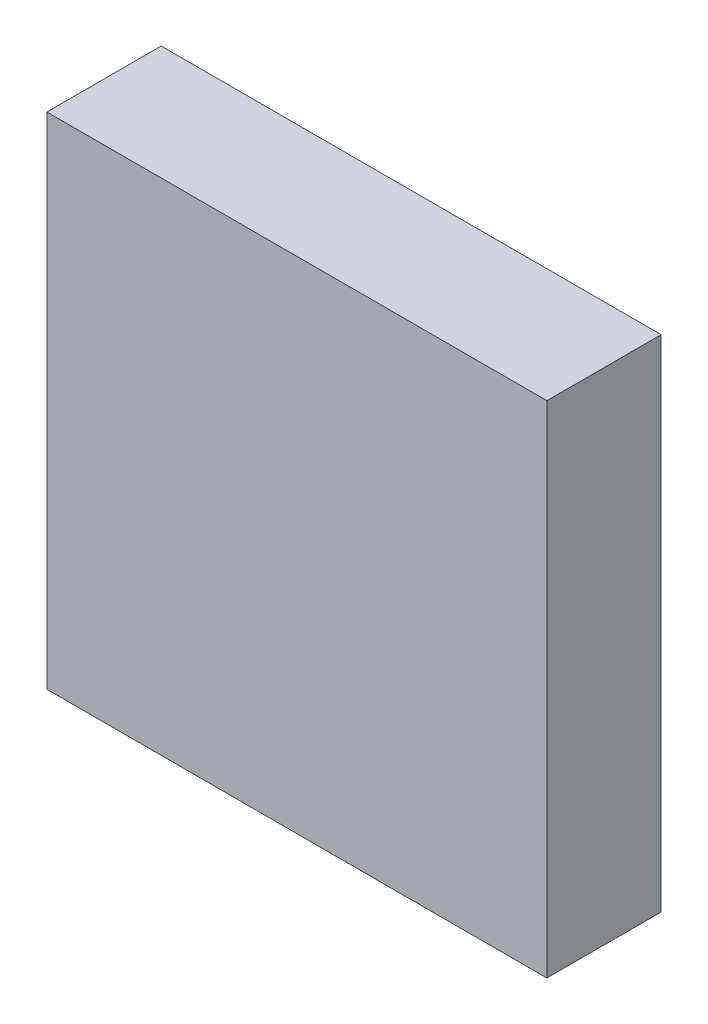
ISO-10303-21;
HEADER;
FILE_DESCRIPTION(('STEP AP214'),'2;1');
FILE_NAME('part.step','',(''),(''),'','','');
FILE_SCHEMA(('AUTOMOTIVE_DESIGN { 1 0 10303 214 1 1 1 1 }'));
ENDSEC;
DATA;
#1=APPLICATION_CONTEXT('core data for automotive mechanical design processes');
#2=APPLICATION_PROTOCOL_DEFINITION('international standard','automotive_design',2000,#1);
#3=PRODUCT_CONTEXT('',#1,'mechanical');
#4=PRODUCT('Part','Part','',(#3));
#5=PRODUCT_RELATED_PRODUCT_CATEGORY('part','',(#4));
#6=PRODUCT_DEFINITION_FORMATION('','',#4);
#7=PRODUCT_DEFINITION_CONTEXT('part definition',#1,'design');
#8=PRODUCT_DEFINITION('design','',#6,#7);
#9=PRODUCT_DEFINITION_SHAPE('','',#8);
#10=(LENGTH_UNIT() NAMED_UNIT(*) SI_UNIT(.MILLI.,.METRE.));
#11=(NAMED_UNIT(*) PLANE_ANGLE_UNIT() SI_UNIT($,.RADIAN.));
#12=(NAMED_UNIT(*) SI_UNIT($,.STERADIAN.) SOLID_ANGLE_UNIT());
#13=UNCERTAINTY_MEASURE_WITH_UNIT(LENGTH_MEASURE(1.E-05),#10,'distance_accuracy_value','');
#14=(GEOMETRIC_REPRESENTATION_CONTEXT(3) GLOBAL_UNCERTAINTY_ASSIGNED_CONTEXT((#13)) GLOBAL_UNIT_ASSIGNED_CONTEXT((#10,
#11,#12)) REPRESENTATION_CONTEXT('',''));
#15=CARTESIAN_POINT('',(0.,0.,0.));
#16=DIRECTION('',(0.,0.,1.));
#17=DIRECTION('',(1.,0.,0.));
#18=AXIS2_PLACEMENT_3D('',#15,#16,#17);
#19=CARTESIAN_POINT('',(-3.50000062,-3.50000062,1.6));
#20=DIRECTION('',(0.,0.,-1.));
#21=DIRECTION('',(-1.,0.,0.));
#22=AXIS2_PLACEMENT_3D('',#19,#20,#21);
#23=PLANE('',#22);
#24=DIRECTION('',(0.,1.,0.));
#25=VECTOR('',#24,1.);
#26=CARTESIAN_POINT('',(3.50000062,-3.50000062,1.6));
#27=LINE('',#26,#25);
#28=CARTESIAN_POINT('',(3.50000062,-3.50000062,1.6));
#29=VERTEX_POINT('',#28);
#30=CARTESIAN_POINT('',(3.50000062,3.50000062,1.6));
#31=VERTEX_POINT('',#30);
#32=EDGE_CURVE('E55',#29,#31,#27,.T.);
#33=ORIENTED_EDGE('',*,*,#32,.T.);
#34=DIRECTION('',(1.,0.,0.));
#35=VECTOR('',#34,1.);
#36=CARTESIAN_POINT('',(3.50000062,3.50000062,1.6));
#37=LINE('',#36,#35);
#38=CARTESIAN_POINT('',(-3.50000062,3.50000062,1.6));
#39=VERTEX_POINT('',#38);
#40=EDGE_CURVE('E57',#31,#39,#37,.F.);
#41=ORIENTED_EDGE('',*,*,#40,.T.);
#42=DIRECTION('',(0.,1.,0.));
#43=VECTOR('',#42,1.);
#44=CARTESIAN_POINT('',(-3.50000062,3.50000062,1.6));
#45=LINE('',#44,#43);
#46=CARTESIAN_POINT('',(-3.50000062,-3.50000062,1.6));
#47=VERTEX_POINT('',#46);
#48=EDGE_CURVE('E20',#39,#47,#45,.F.);
#49=ORIENTED_EDGE('',*,*,#48,.T.);
#50=DIRECTION('',(1.,0.,0.));
#51=VECTOR('',#50,1.);
#52=CARTESIAN_POINT('',(-3.50000062,-3.50000062,1.6));
#53=LINE('',#52,#51);
#54=EDGE_CURVE('E80',#47,#29,#53,.T.);
#55=ORIENTED_EDGE('',*,*,#54,.T.);
#56=EDGE_LOOP('',(#33,#41,#49,#55));
#57=FACE_BOUND('',#56,.T.);
#58=ADVANCED_FACE('F17',(#57),#23,.F.);
#59=CARTESIAN_POINT('',(-3.50000062,3.50000062,0.));
#60=DIRECTION('',(1.,0.,0.));
#61=DIRECTION('',(0.,0.,-1.));
#62=AXIS2_PLACEMENT_3D('',#59,#60,#61);
#63=PLANE('',#62);
#64=DIRECTION('',(0.,0.,1.));
#65=VECTOR('',#64,1.);
#66=CARTESIAN_POINT('',(-3.50000062,-3.50000062,0.));
#67=LINE('',#66,#65);
#68=CARTESIAN_POINT('',(-3.50000062,-3.50000062,0.));
#69=VERTEX_POINT('',#68);
#70=EDGE_CURVE('E68',#69,#47,#67,.T.);
#71=ORIENTED_EDGE('',*,*,#70,.T.);
#72=ORIENTED_EDGE('',*,*,#48,.F.);
#73=DIRECTION('',(0.,0.,-1.));
#74=VECTOR('',#73,1.);
#75=CARTESIAN_POINT('',(-3.50000062,3.50000062,0.));
#76=LINE('',#75,#74);
#77=CARTESIAN_POINT('',(-3.50000062,3.50000062,0.));
#78=VERTEX_POINT('',#77);
#79=EDGE_CURVE('E63',#39,#78,#76,.T.);
#80=ORIENTED_EDGE('',*,*,#79,.T.);
#81=DIRECTION('',(0.,1.,0.));
#82=VECTOR('',#81,1.);
#83=CARTESIAN_POINT('',(-3.50000062,-3.50000062,0.));
#84=LINE('',#83,#82);
#85=EDGE_CURVE('E83',#69,#78,#84,.T.);
#86=ORIENTED_EDGE('',*,*,#85,.F.);
#87=EDGE_LOOP('',(#71,#72,#80,#86));
#88=FACE_BOUND('',#87,.T.);
#89=ADVANCED_FACE('F65',(#88),#63,.F.);
#90=CARTESIAN_POINT('',(3.50000062,3.50000062,0.));
#91=DIRECTION('',(0.,-1.,0.));
#92=DIRECTION('',(0.,0.,-1.));
#93=AXIS2_PLACEMENT_3D('',#90,#91,#92);
#94=PLANE('',#93);
#95=ORIENTED_EDGE('',*,*,#79,.F.);
#96=ORIENTED_EDGE('',*,*,#40,.F.);
#97=DIRECTION('',(0.,0.,1.));
#98=VECTOR('',#97,1.);
#99=CARTESIAN_POINT('',(3.50000062,3.50000062,0.));
#100=LINE('',#99,#98);
#101=CARTESIAN_POINT('',(3.50000062,3.50000062,0.));
#102=VERTEX_POINT('',#101);
#103=EDGE_CURVE('E75',#31,#102,#100,.F.);
#104=ORIENTED_EDGE('',*,*,#103,.T.);
#105=DIRECTION('',(-1.,0.,0.));
#106=VECTOR('',#105,1.);
#107=CARTESIAN_POINT('',(-3.50000062,3.50000062,0.));
#108=LINE('',#107,#106);
#109=EDGE_CURVE('E72',#78,#102,#108,.F.);
#110=ORIENTED_EDGE('',*,*,#109,.F.);
#111=EDGE_LOOP('',(#95,#96,#104,#110));
#112=FACE_BOUND('',#111,.T.);
#113=ADVANCED_FACE('F70',(#112),#94,.F.);
#114=CARTESIAN_POINT('',(3.50000062,-3.50000062,0.));
#115=DIRECTION('',(-1.,0.,0.));
#116=DIRECTION('',(0.,0.,1.));
#117=AXIS2_PLACEMENT_3D('',#114,#115,#116);
#118=PLANE('',#117);
#119=ORIENTED_EDGE('',*,*,#103,.F.);
#120=ORIENTED_EDGE('',*,*,#32,.F.);
#121=DIRECTION('',(0.,0.,1.));
#122=VECTOR('',#121,1.);
#123=CARTESIAN_POINT('',(3.50000062,-3.50000062,0.));
#124=LINE('',#123,#122);
#125=CARTESIAN_POINT('',(3.50000062,-3.50000062,0.));
#126=VERTEX_POINT('',#125);
#127=EDGE_CURVE('E35',#29,#126,#124,.F.);
#128=ORIENTED_EDGE('',*,*,#127,.T.);
#129=DIRECTION('',(0.,1.,0.));
#130=VECTOR('',#129,1.);
#131=CARTESIAN_POINT('',(3.50000062,-3.50000062,0.));
#132=LINE('',#131,#130);
#133=EDGE_CURVE('E26',#102,#126,#132,.F.);
#134=ORIENTED_EDGE('',*,*,#133,.F.);
#135=EDGE_LOOP('',(#119,#120,#128,#134));
#136=FACE_BOUND('',#135,.T.);
#137=ADVANCED_FACE('F89',(#136),#118,.F.);
#138=CARTESIAN_POINT('',(-3.50000062,-3.50000062,0.));
#139=DIRECTION('',(0.,1.,0.));
#140=DIRECTION('',(0.,0.,1.));
#141=AXIS2_PLACEMENT_3D('',#138,#139,#140);
#142=PLANE('',#141);
#143=ORIENTED_EDGE('',*,*,#127,.F.);
#144=ORIENTED_EDGE('',*,*,#54,.F.);
#145=ORIENTED_EDGE('',*,*,#70,.F.);
#146=DIRECTION('',(-1.,0.,0.));
#147=VECTOR('',#146,1.);
#148=CARTESIAN_POINT('',(-3.50000062,-3.50000062,0.));
#149=LINE('',#148,#147);
#150=EDGE_CURVE('E11',#126,#69,#149,.T.);
#151=ORIENTED_EDGE('',*,*,#150,.F.);
#152=EDGE_LOOP('',(#143,#144,#145,#151));
#153=FACE_BOUND('',#152,.T.);
#154=ADVANCED_FACE('F91',(#153),#142,.F.);
#155=CARTESIAN_POINT('',(-3.50000062,-3.50000062,0.));
#156=DIRECTION('',(0.,0.,-1.));
#157=DIRECTION('',(-1.,0.,0.));
#158=AXIS2_PLACEMENT_3D('',#155,#156,#157);
#159=PLANE('',#158);
#160=ORIENTED_EDGE('',*,*,#133,.T.);
#161=ORIENTED_EDGE('',*,*,#150,.T.);
#162=ORIENTED_EDGE('',*,*,#85,.T.);
#163=ORIENTED_EDGE('',*,*,#109,.T.);
#164=EDGE_LOOP('',(#160,#161,#162,#163));
#165=FACE_BOUND('',#164,.T.);
#166=ADVANCED_FACE('F88',(#165),#159,.T.);
#167=CLOSED_SHELL('',(#58,#89,#113,#137,#154,#166));
#168=MANIFOLD_SOLID_BREP('B1',#167);
#169=ADVANCED_BREP_SHAPE_REPRESENTATION('',(#18,#168),#14);
#170=SHAPE_DEFINITION_REPRESENTATION(#9,#169);
ENDSEC;
END-ISO-10303-21;
